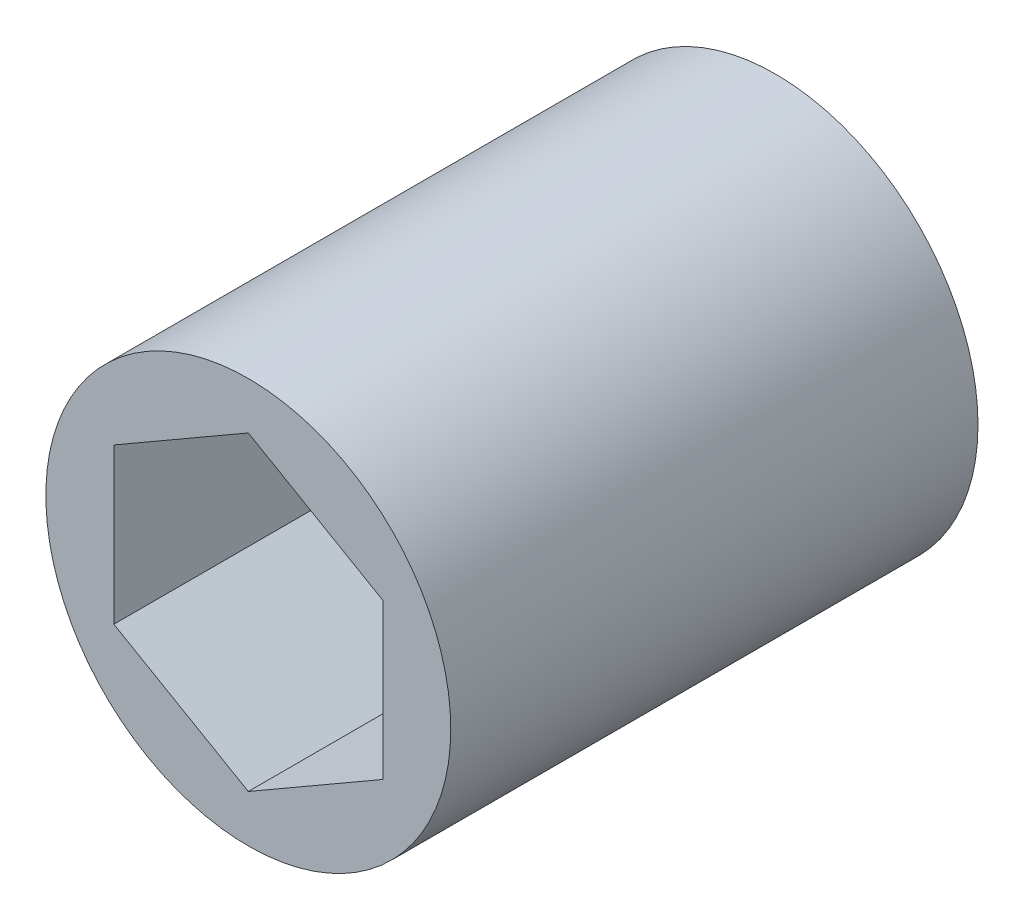
ISO-10303-21;
HEADER;
FILE_DESCRIPTION(('STEP AP214'),'2;1');
FILE_NAME('part.step','',(''),(''),'','','');
FILE_SCHEMA(('AUTOMOTIVE_DESIGN { 1 0 10303 214 1 1 1 1 }'));
ENDSEC;
DATA;
#1=APPLICATION_CONTEXT('core data for automotive mechanical design processes');
#2=APPLICATION_PROTOCOL_DEFINITION('international standard','automotive_design',2000,#1);
#3=PRODUCT_CONTEXT('',#1,'mechanical');
#4=PRODUCT('Part','Part','',(#3));
#5=PRODUCT_RELATED_PRODUCT_CATEGORY('part','',(#4));
#6=PRODUCT_DEFINITION_FORMATION('','',#4);
#7=PRODUCT_DEFINITION_CONTEXT('part definition',#1,'design');
#8=PRODUCT_DEFINITION('design','',#6,#7);
#9=PRODUCT_DEFINITION_SHAPE('','',#8);
#10=(LENGTH_UNIT() NAMED_UNIT(*) SI_UNIT(.MILLI.,.METRE.));
#11=(NAMED_UNIT(*) PLANE_ANGLE_UNIT() SI_UNIT($,.RADIAN.));
#12=(NAMED_UNIT(*) SI_UNIT($,.STERADIAN.) SOLID_ANGLE_UNIT());
#13=UNCERTAINTY_MEASURE_WITH_UNIT(LENGTH_MEASURE(1.E-05),#10,'distance_accuracy_value','');
#14=(GEOMETRIC_REPRESENTATION_CONTEXT(3) GLOBAL_UNCERTAINTY_ASSIGNED_CONTEXT((#13)) GLOBAL_UNIT_ASSIGNED_CONTEXT((#10,
#11,#12)) REPRESENTATION_CONTEXT('',''));
#15=CARTESIAN_POINT('',(0.,0.,0.));
#16=DIRECTION('',(0.,0.,1.));
#17=DIRECTION('',(1.,0.,0.));
#18=AXIS2_PLACEMENT_3D('',#15,#16,#17);
#19=CARTESIAN_POINT('',(0.,0.,25.4));
#20=DIRECTION('',(0.,0.,1.));
#21=DIRECTION('',(1.,0.,0.));
#22=AXIS2_PLACEMENT_3D('',#19,#20,#21);
#23=PLANE('',#22);
#24=CARTESIAN_POINT('',(0.,0.,25.4));
#25=DIRECTION('',(0.,0.,1.));
#26=DIRECTION('',(1.,0.,0.));
#27=AXIS2_PLACEMENT_3D('',#24,#25,#26);
#28=CIRCLE('',#27,9.7536);
#29=CARTESIAN_POINT('',(9.7536,0.,25.4));
#30=VERTEX_POINT('',#29);
#31=EDGE_CURVE('E11',#30,#30,#28,.T.);
#32=ORIENTED_EDGE('',*,*,#31,.T.);
#33=EDGE_LOOP('',(#32));
#34=FACE_BOUND('',#33,.T.);
#35=DIRECTION('',(-0.866025403784439,-0.5,0.));
#36=VECTOR('',#35,1.);
#37=CARTESIAN_POINT('',(0.,7.47899538708241,25.4));
#38=LINE('',#37,#36);
#39=CARTESIAN_POINT('',(0.,7.47899538708241,25.4));
#40=VERTEX_POINT('',#39);
#41=CARTESIAN_POINT('',(-6.477,3.73949769354121,25.4));
#42=VERTEX_POINT('',#41);
#43=EDGE_CURVE('E104',#40,#42,#38,.T.);
#44=ORIENTED_EDGE('',*,*,#43,.F.);
#45=DIRECTION('',(-0.866025403784439,0.5,0.));
#46=VECTOR('',#45,1.);
#47=CARTESIAN_POINT('',(6.477,3.73949769354121,25.4));
#48=LINE('',#47,#46);
#49=CARTESIAN_POINT('',(6.477,3.73949769354121,25.4));
#50=VERTEX_POINT('',#49);
#51=EDGE_CURVE('E96',#50,#40,#48,.T.);
#52=ORIENTED_EDGE('',*,*,#51,.F.);
#53=DIRECTION('',(0.,1.,0.));
#54=VECTOR('',#53,1.);
#55=CARTESIAN_POINT('',(6.477,-3.73949769354121,25.4));
#56=LINE('',#55,#54);
#57=CARTESIAN_POINT('',(6.477,-3.73949769354121,25.4));
#58=VERTEX_POINT('',#57);
#59=EDGE_CURVE('E125',#58,#50,#56,.T.);
#60=ORIENTED_EDGE('',*,*,#59,.F.);
#61=DIRECTION('',(0.866025403784439,0.5,0.));
#62=VECTOR('',#61,1.);
#63=CARTESIAN_POINT('',(0.,-7.47899538708241,25.4));
#64=LINE('',#63,#62);
#65=CARTESIAN_POINT('',(0.,-7.47899538708241,25.4));
#66=VERTEX_POINT('',#65);
#67=EDGE_CURVE('E123',#66,#58,#64,.T.);
#68=ORIENTED_EDGE('',*,*,#67,.F.);
#69=DIRECTION('',(0.866025403784439,-0.5,0.));
#70=VECTOR('',#69,1.);
#71=CARTESIAN_POINT('',(-6.477,-3.73949769354121,25.4));
#72=LINE('',#71,#70);
#73=CARTESIAN_POINT('',(-6.477,-3.73949769354121,25.4));
#74=VERTEX_POINT('',#73);
#75=EDGE_CURVE('E119',#74,#66,#72,.T.);
#76=ORIENTED_EDGE('',*,*,#75,.F.);
#77=DIRECTION('',(0.,-1.,0.));
#78=VECTOR('',#77,1.);
#79=CARTESIAN_POINT('',(-6.477,3.73949769354121,25.4));
#80=LINE('',#79,#78);
#81=EDGE_CURVE('E117',#42,#74,#80,.T.);
#82=ORIENTED_EDGE('',*,*,#81,.F.);
#83=EDGE_LOOP('',(#44,#52,#60,#68,#76,#82));
#84=FACE_BOUND('',#83,.T.);
#85=ADVANCED_FACE('F43',(#34,#84),#23,.T.);
#86=CARTESIAN_POINT('',(0.,0.,0.));
#87=DIRECTION('',(0.,0.,1.));
#88=DIRECTION('',(1.,0.,0.));
#89=AXIS2_PLACEMENT_3D('',#86,#87,#88);
#90=PLANE('',#89);
#91=CARTESIAN_POINT('',(0.,0.,0.));
#92=DIRECTION('',(0.,0.,1.));
#93=DIRECTION('',(1.,0.,0.));
#94=AXIS2_PLACEMENT_3D('',#91,#92,#93);
#95=CIRCLE('',#94,9.7536);
#96=CARTESIAN_POINT('',(9.7536,0.,0.));
#97=VERTEX_POINT('',#96);
#98=EDGE_CURVE('E47',#97,#97,#95,.T.);
#99=ORIENTED_EDGE('',*,*,#98,.F.);
#100=EDGE_LOOP('',(#99));
#101=FACE_BOUND('',#100,.T.);
#102=DIRECTION('',(-0.866025403784439,0.5,0.));
#103=VECTOR('',#102,1.);
#104=CARTESIAN_POINT('',(6.477,3.73949769354121,0.));
#105=LINE('',#104,#103);
#106=CARTESIAN_POINT('',(6.477,3.73949769354121,0.));
#107=VERTEX_POINT('',#106);
#108=CARTESIAN_POINT('',(0.,7.47899538708241,0.));
#109=VERTEX_POINT('',#108);
#110=EDGE_CURVE('E66',#107,#109,#105,.T.);
#111=ORIENTED_EDGE('',*,*,#110,.T.);
#112=DIRECTION('',(-0.866025403784439,-0.5,0.));
#113=VECTOR('',#112,1.);
#114=CARTESIAN_POINT('',(0.,7.47899538708241,0.));
#115=LINE('',#114,#113);
#116=CARTESIAN_POINT('',(-6.477,3.73949769354121,0.));
#117=VERTEX_POINT('',#116);
#118=EDGE_CURVE('E111',#109,#117,#115,.T.);
#119=ORIENTED_EDGE('',*,*,#118,.T.);
#120=DIRECTION('',(0.,-1.,0.));
#121=VECTOR('',#120,1.);
#122=CARTESIAN_POINT('',(-6.477,3.73949769354121,0.));
#123=LINE('',#122,#121);
#124=CARTESIAN_POINT('',(-6.477,-3.73949769354121,0.));
#125=VERTEX_POINT('',#124);
#126=EDGE_CURVE('E129',#117,#125,#123,.T.);
#127=ORIENTED_EDGE('',*,*,#126,.T.);
#128=DIRECTION('',(0.866025403784439,-0.5,0.));
#129=VECTOR('',#128,1.);
#130=CARTESIAN_POINT('',(-6.477,-3.73949769354121,0.));
#131=LINE('',#130,#129);
#132=CARTESIAN_POINT('',(0.,-7.47899538708241,0.));
#133=VERTEX_POINT('',#132);
#134=EDGE_CURVE('E132',#125,#133,#131,.T.);
#135=ORIENTED_EDGE('',*,*,#134,.T.);
#136=DIRECTION('',(0.866025403784439,0.5,0.));
#137=VECTOR('',#136,1.);
#138=CARTESIAN_POINT('',(0.,-7.47899538708241,0.));
#139=LINE('',#138,#137);
#140=CARTESIAN_POINT('',(6.477,-3.73949769354121,0.));
#141=VERTEX_POINT('',#140);
#142=EDGE_CURVE('E135',#133,#141,#139,.T.);
#143=ORIENTED_EDGE('',*,*,#142,.T.);
#144=DIRECTION('',(0.,1.,0.));
#145=VECTOR('',#144,1.);
#146=CARTESIAN_POINT('',(6.477,-3.73949769354121,0.));
#147=LINE('',#146,#145);
#148=EDGE_CURVE('E105',#141,#107,#147,.T.);
#149=ORIENTED_EDGE('',*,*,#148,.T.);
#150=EDGE_LOOP('',(#111,#119,#127,#135,#143,#149));
#151=FACE_BOUND('',#150,.T.);
#152=ADVANCED_FACE('F156',(#101,#151),#90,.F.);
#153=CARTESIAN_POINT('',(0.,0.,25.4));
#154=DIRECTION('',(0.,0.,-1.));
#155=DIRECTION('',(-1.,0.,0.));
#156=AXIS2_PLACEMENT_3D('',#153,#154,#155);
#157=CYLINDRICAL_SURFACE('',#156,9.7536);
#158=ORIENTED_EDGE('',*,*,#31,.F.);
#159=EDGE_LOOP('',(#158));
#160=FACE_BOUND('',#159,.T.);
#161=ORIENTED_EDGE('',*,*,#98,.T.);
#162=EDGE_LOOP('',(#161));
#163=FACE_BOUND('',#162,.T.);
#164=ADVANCED_FACE('F45',(#160,#163),#157,.T.);
#165=CARTESIAN_POINT('',(6.477,3.73949769354121,25.4));
#166=DIRECTION('',(-0.5,-0.866025403784439,0.));
#167=DIRECTION('',(0.866025403784439,-0.5,0.));
#168=AXIS2_PLACEMENT_3D('',#165,#166,#167);
#169=PLANE('',#168);
#170=ORIENTED_EDGE('',*,*,#110,.F.);
#171=DIRECTION('',(0.,0.,-1.));
#172=VECTOR('',#171,1.);
#173=CARTESIAN_POINT('',(6.477,3.73949769354121,25.4));
#174=LINE('',#173,#172);
#175=EDGE_CURVE('E100',#50,#107,#174,.T.);
#176=ORIENTED_EDGE('',*,*,#175,.F.);
#177=ORIENTED_EDGE('',*,*,#51,.T.);
#178=DIRECTION('',(0.,0.,-1.));
#179=VECTOR('',#178,1.);
#180=CARTESIAN_POINT('',(0.,7.47899538708241,25.4));
#181=LINE('',#180,#179);
#182=EDGE_CURVE('E99',#40,#109,#181,.T.);
#183=ORIENTED_EDGE('',*,*,#182,.T.);
#184=EDGE_LOOP('',(#170,#176,#177,#183));
#185=FACE_BOUND('',#184,.T.);
#186=ADVANCED_FACE('F98',(#185),#169,.T.);
#187=CARTESIAN_POINT('',(0.,7.47899538708241,25.4));
#188=DIRECTION('',(0.5,-0.866025403784439,0.));
#189=DIRECTION('',(0.866025403784439,0.5,0.));
#190=AXIS2_PLACEMENT_3D('',#187,#188,#189);
#191=PLANE('',#190);
#192=ORIENTED_EDGE('',*,*,#118,.F.);
#193=ORIENTED_EDGE('',*,*,#182,.F.);
#194=ORIENTED_EDGE('',*,*,#43,.T.);
#195=DIRECTION('',(0.,0.,-1.));
#196=VECTOR('',#195,1.);
#197=CARTESIAN_POINT('',(-6.477,3.73949769354121,25.4));
#198=LINE('',#197,#196);
#199=EDGE_CURVE('E113',#42,#117,#198,.T.);
#200=ORIENTED_EDGE('',*,*,#199,.T.);
#201=EDGE_LOOP('',(#192,#193,#194,#200));
#202=FACE_BOUND('',#201,.T.);
#203=ADVANCED_FACE('F108',(#202),#191,.T.);
#204=CARTESIAN_POINT('',(-6.477,3.73949769354121,25.4));
#205=DIRECTION('',(1.,0.,0.));
#206=DIRECTION('',(0.,0.,-1.));
#207=AXIS2_PLACEMENT_3D('',#204,#205,#206);
#208=PLANE('',#207);
#209=ORIENTED_EDGE('',*,*,#126,.F.);
#210=ORIENTED_EDGE('',*,*,#199,.F.);
#211=ORIENTED_EDGE('',*,*,#81,.T.);
#212=DIRECTION('',(0.,0.,-1.));
#213=VECTOR('',#212,1.);
#214=CARTESIAN_POINT('',(-6.477,-3.73949769354121,25.4));
#215=LINE('',#214,#213);
#216=EDGE_CURVE('E146',#74,#125,#215,.T.);
#217=ORIENTED_EDGE('',*,*,#216,.T.);
#218=EDGE_LOOP('',(#209,#210,#211,#217));
#219=FACE_BOUND('',#218,.T.);
#220=ADVANCED_FACE('F152',(#219),#208,.T.);
#221=CARTESIAN_POINT('',(-6.477,-3.73949769354121,25.4));
#222=DIRECTION('',(0.5,0.866025403784439,0.));
#223=DIRECTION('',(-0.866025403784439,0.5,0.));
#224=AXIS2_PLACEMENT_3D('',#221,#222,#223);
#225=PLANE('',#224);
#226=ORIENTED_EDGE('',*,*,#134,.F.);
#227=ORIENTED_EDGE('',*,*,#216,.F.);
#228=ORIENTED_EDGE('',*,*,#75,.T.);
#229=DIRECTION('',(0.,0.,-1.));
#230=VECTOR('',#229,1.);
#231=CARTESIAN_POINT('',(0.,-7.47899538708241,25.4));
#232=LINE('',#231,#230);
#233=EDGE_CURVE('E144',#66,#133,#232,.T.);
#234=ORIENTED_EDGE('',*,*,#233,.T.);
#235=EDGE_LOOP('',(#226,#227,#228,#234));
#236=FACE_BOUND('',#235,.T.);
#237=ADVANCED_FACE('F164',(#236),#225,.T.);
#238=CARTESIAN_POINT('',(0.,-7.47899538708241,25.4));
#239=DIRECTION('',(-0.5,0.866025403784439,0.));
#240=DIRECTION('',(-0.866025403784439,-0.5,0.));
#241=AXIS2_PLACEMENT_3D('',#238,#239,#240);
#242=PLANE('',#241);
#243=ORIENTED_EDGE('',*,*,#142,.F.);
#244=ORIENTED_EDGE('',*,*,#233,.F.);
#245=ORIENTED_EDGE('',*,*,#67,.T.);
#246=DIRECTION('',(0.,0.,-1.));
#247=VECTOR('',#246,1.);
#248=CARTESIAN_POINT('',(6.477,-3.73949769354121,25.4));
#249=LINE('',#248,#247);
#250=EDGE_CURVE('E58',#58,#141,#249,.T.);
#251=ORIENTED_EDGE('',*,*,#250,.T.);
#252=EDGE_LOOP('',(#243,#244,#245,#251));
#253=FACE_BOUND('',#252,.T.);
#254=ADVANCED_FACE('F162',(#253),#242,.T.);
#255=CARTESIAN_POINT('',(6.477,-3.73949769354121,25.4));
#256=DIRECTION('',(-1.,0.,0.));
#257=DIRECTION('',(0.,-1.,0.));
#258=AXIS2_PLACEMENT_3D('',#255,#256,#257);
#259=PLANE('',#258);
#260=ORIENTED_EDGE('',*,*,#148,.F.);
#261=ORIENTED_EDGE('',*,*,#250,.F.);
#262=ORIENTED_EDGE('',*,*,#59,.T.);
#263=ORIENTED_EDGE('',*,*,#175,.T.);
#264=EDGE_LOOP('',(#260,#261,#262,#263));
#265=FACE_BOUND('',#264,.T.);
#266=ADVANCED_FACE('F158',(#265),#259,.T.);
#267=CLOSED_SHELL('',(#85,#152,#164,#186,#203,#220,#237,#254,#266));
#268=MANIFOLD_SOLID_BREP('B2',#267);
#269=ADVANCED_BREP_SHAPE_REPRESENTATION('',(#18,#268),#14);
#270=SHAPE_DEFINITION_REPRESENTATION(#9,#269);
ENDSEC;
END-ISO-10303-21;
